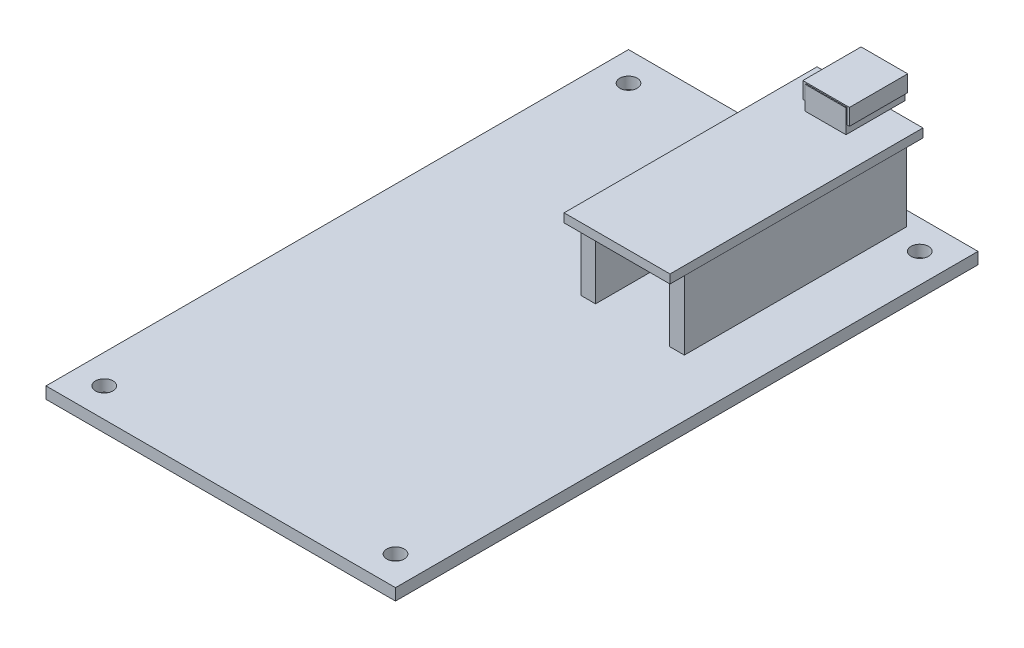
ISO-10303-21;
HEADER;
FILE_DESCRIPTION(('STEP AP214'),'2;1');
FILE_NAME('part.step','',(''),(''),'','','');
FILE_SCHEMA(('AUTOMOTIVE_DESIGN { 1 0 10303 214 1 1 1 1 }'));
ENDSEC;
DATA;
#1=APPLICATION_CONTEXT('core data for automotive mechanical design processes');
#2=APPLICATION_PROTOCOL_DEFINITION('international standard','automotive_design',2000,#1);
#3=PRODUCT_CONTEXT('',#1,'mechanical');
#4=PRODUCT('Part','Part','',(#3));
#5=PRODUCT_RELATED_PRODUCT_CATEGORY('part','',(#4));
#6=PRODUCT_DEFINITION_FORMATION('','',#4);
#7=PRODUCT_DEFINITION_CONTEXT('part definition',#1,'design');
#8=PRODUCT_DEFINITION('design','',#6,#7);
#9=PRODUCT_DEFINITION_SHAPE('','',#8);
#10=(LENGTH_UNIT() NAMED_UNIT(*) SI_UNIT(.MILLI.,.METRE.));
#11=(NAMED_UNIT(*) PLANE_ANGLE_UNIT() SI_UNIT($,.RADIAN.));
#12=(NAMED_UNIT(*) SI_UNIT($,.STERADIAN.) SOLID_ANGLE_UNIT());
#13=UNCERTAINTY_MEASURE_WITH_UNIT(LENGTH_MEASURE(1.E-05),#10,'distance_accuracy_value','');
#14=(GEOMETRIC_REPRESENTATION_CONTEXT(3) GLOBAL_UNCERTAINTY_ASSIGNED_CONTEXT((#13)) GLOBAL_UNIT_ASSIGNED_CONTEXT((#10,
#11,#12)) REPRESENTATION_CONTEXT('',''));
#15=CARTESIAN_POINT('',(0.,0.,0.));
#16=DIRECTION('',(0.,0.,1.));
#17=DIRECTION('',(1.,0.,0.));
#18=AXIS2_PLACEMENT_3D('',#15,#16,#17);
#19=CARTESIAN_POINT('',(7.831,19.5,-42.505));
#20=DIRECTION('',(1.,0.,0.));
#21=DIRECTION('',(0.,0.,-1.));
#22=AXIS2_PLACEMENT_3D('',#19,#20,#21);
#23=PLANE('',#22);
#24=DIRECTION('',(0.,1.,0.));
#25=VECTOR('',#24,1.);
#26=CARTESIAN_POINT('',(7.831,19.5,-42.665));
#27=LINE('',#26,#25);
#28=CARTESIAN_POINT('',(7.831,15.5,-42.665));
#29=VERTEX_POINT('',#28);
#30=CARTESIAN_POINT('',(7.831,19.5,-42.665));
#31=VERTEX_POINT('',#30);
#32=EDGE_CURVE('E220',#29,#31,#27,.T.);
#33=ORIENTED_EDGE('',*,*,#32,.F.);
#34=DIRECTION('',(0.,0.,1.));
#35=VECTOR('',#34,1.);
#36=CARTESIAN_POINT('',(7.831,15.5,-42.505));
#37=LINE('',#36,#35);
#38=CARTESIAN_POINT('',(7.831,15.5,-42.505));
#39=VERTEX_POINT('',#38);
#40=EDGE_CURVE('E50',#29,#39,#37,.T.);
#41=ORIENTED_EDGE('',*,*,#40,.T.);
#42=DIRECTION('',(0.,-1.,0.));
#43=VECTOR('',#42,1.);
#44=CARTESIAN_POINT('',(7.831,19.5,-42.505));
#45=LINE('',#44,#43);
#46=CARTESIAN_POINT('',(7.831,19.5,-42.505));
#47=VERTEX_POINT('',#46);
#48=EDGE_CURVE('E248',#47,#39,#45,.T.);
#49=ORIENTED_EDGE('',*,*,#48,.F.);
#50=DIRECTION('',(0.,0.,1.));
#51=VECTOR('',#50,1.);
#52=CARTESIAN_POINT('',(7.831,19.5,-42.505));
#53=LINE('',#52,#51);
#54=EDGE_CURVE('E226',#31,#47,#53,.T.);
#55=ORIENTED_EDGE('',*,*,#54,.F.);
#56=EDGE_LOOP('',(#33,#41,#49,#55));
#57=FACE_BOUND('',#56,.T.);
#58=ADVANCED_FACE('F42',(#57),#23,.F.);
#59=CARTESIAN_POINT('',(0.,19.5,0.));
#60=DIRECTION('',(0.,1.,0.));
#61=DIRECTION('',(0.,0.,1.));
#62=AXIS2_PLACEMENT_3D('',#59,#60,#61);
#63=PLANE('',#62);
#64=DIRECTION('',(0.,0.,-1.));
#65=VECTOR('',#64,1.);
#66=CARTESIAN_POINT('',(14.831,19.5,-42.505));
#67=LINE('',#66,#65);
#68=CARTESIAN_POINT('',(14.831,19.5,-42.505));
#69=VERTEX_POINT('',#68);
#70=CARTESIAN_POINT('',(14.831,19.5,-42.665));
#71=VERTEX_POINT('',#70);
#72=EDGE_CURVE('E231',#69,#71,#67,.T.);
#73=ORIENTED_EDGE('',*,*,#72,.T.);
#74=DIRECTION('',(-1.,0.,0.));
#75=VECTOR('',#74,1.);
#76=CARTESIAN_POINT('',(0.,19.5,-42.665));
#77=LINE('',#76,#75);
#78=EDGE_CURVE('E12',#71,#31,#77,.T.);
#79=ORIENTED_EDGE('',*,*,#78,.T.);
#80=ORIENTED_EDGE('',*,*,#54,.T.);
#81=DIRECTION('',(1.,0.,0.));
#82=VECTOR('',#81,1.);
#83=CARTESIAN_POINT('',(14.831,19.5,-42.505));
#84=LINE('',#83,#82);
#85=EDGE_CURVE('E228',#47,#69,#84,.T.);
#86=ORIENTED_EDGE('',*,*,#85,.T.);
#87=EDGE_LOOP('',(#73,#79,#80,#86));
#88=FACE_BOUND('',#87,.T.);
#89=ADVANCED_FACE('F325',(#88),#63,.T.);
#90=CARTESIAN_POINT('',(0.,15.5,0.));
#91=DIRECTION('',(0.,-1.,0.));
#92=DIRECTION('',(0.,0.,-1.));
#93=AXIS2_PLACEMENT_3D('',#90,#91,#92);
#94=PLANE('',#93);
#95=DIRECTION('',(-1.,0.,0.));
#96=VECTOR('',#95,1.);
#97=CARTESIAN_POINT('',(14.7648969304243,15.5,-42.665));
#98=LINE('',#97,#96);
#99=CARTESIAN_POINT('',(7.76489693042429,15.5,-42.665));
#100=VERTEX_POINT('',#99);
#101=EDGE_CURVE('E57',#29,#100,#98,.T.);
#102=ORIENTED_EDGE('',*,*,#101,.T.);
#103=DIRECTION('',(0.,0.,-1.));
#104=VECTOR('',#103,1.);
#105=CARTESIAN_POINT('',(7.76489693042429,15.5,-42.665));
#106=LINE('',#105,#104);
#107=CARTESIAN_POINT('',(7.76489693042429,15.5,-50.125));
#108=VERTEX_POINT('',#107);
#109=EDGE_CURVE('E217',#100,#108,#106,.T.);
#110=ORIENTED_EDGE('',*,*,#109,.T.);
#111=DIRECTION('',(-1.,0.,0.));
#112=VECTOR('',#111,1.);
#113=CARTESIAN_POINT('',(20.421,15.5,-50.125));
#114=LINE('',#113,#112);
#115=CARTESIAN_POINT('',(2.241,15.5,-50.125));
#116=VERTEX_POINT('',#115);
#117=EDGE_CURVE('E259',#108,#116,#114,.T.);
#118=ORIENTED_EDGE('',*,*,#117,.T.);
#119=DIRECTION('',(0.,0.,-1.));
#120=VECTOR('',#119,1.);
#121=CARTESIAN_POINT('',(2.241,15.5,-6.70499999999999));
#122=LINE('',#121,#120);
#123=CARTESIAN_POINT('',(2.241,15.5,-6.70499999999999));
#124=VERTEX_POINT('',#123);
#125=EDGE_CURVE('E255',#124,#116,#122,.T.);
#126=ORIENTED_EDGE('',*,*,#125,.F.);
#127=DIRECTION('',(-1.,0.,0.));
#128=VECTOR('',#127,1.);
#129=CARTESIAN_POINT('',(20.421,15.5,-6.70499999999999));
#130=LINE('',#129,#128);
#131=CARTESIAN_POINT('',(20.421,15.5,-6.70499999999999));
#132=VERTEX_POINT('',#131);
#133=EDGE_CURVE('E252',#132,#124,#130,.T.);
#134=ORIENTED_EDGE('',*,*,#133,.F.);
#135=DIRECTION('',(0.,0.,-1.));
#136=VECTOR('',#135,1.);
#137=CARTESIAN_POINT('',(20.421,15.5,-6.70499999999999));
#138=LINE('',#137,#136);
#139=CARTESIAN_POINT('',(20.421,15.5,-50.125));
#140=VERTEX_POINT('',#139);
#141=EDGE_CURVE('E263',#132,#140,#138,.T.);
#142=ORIENTED_EDGE('',*,*,#141,.T.);
#143=CARTESIAN_POINT('',(14.831,15.5,-50.125));
#144=VERTEX_POINT('',#143);
#145=EDGE_CURVE('E260',#140,#144,#114,.T.);
#146=ORIENTED_EDGE('',*,*,#145,.T.);
#147=DIRECTION('',(0.,0.,-1.));
#148=VECTOR('',#147,1.);
#149=CARTESIAN_POINT('',(14.831,15.5,-42.505));
#150=LINE('',#149,#148);
#151=CARTESIAN_POINT('',(14.831,15.5,-42.505));
#152=VERTEX_POINT('',#151);
#153=EDGE_CURVE('E240',#152,#144,#150,.T.);
#154=ORIENTED_EDGE('',*,*,#153,.F.);
#155=DIRECTION('',(1.,0.,0.));
#156=VECTOR('',#155,1.);
#157=CARTESIAN_POINT('',(14.831,15.5,-42.505));
#158=LINE('',#157,#156);
#159=EDGE_CURVE('E225',#39,#152,#158,.T.);
#160=ORIENTED_EDGE('',*,*,#159,.F.);
#161=ORIENTED_EDGE('',*,*,#40,.F.);
#162=EDGE_LOOP('',(#102,#110,#118,#126,#134,#142,#146,#154,#160,#161));
#163=FACE_BOUND('',#162,.T.);
#164=ADVANCED_FACE('F300',(#163),#94,.F.);
#165=CARTESIAN_POINT('',(20.421,15.5,-6.70499999999999));
#166=DIRECTION('',(0.,0.,1.));
#167=DIRECTION('',(1.,0.,0.));
#168=AXIS2_PLACEMENT_3D('',#165,#166,#167);
#169=PLANE('',#168);
#170=DIRECTION('',(-1.,0.,0.));
#171=VECTOR('',#170,1.);
#172=CARTESIAN_POINT('',(20.421,14.,-6.70499999999999));
#173=LINE('',#172,#171);
#174=CARTESIAN_POINT('',(20.421,14.,-6.70499999999999));
#175=VERTEX_POINT('',#174);
#176=CARTESIAN_POINT('',(2.241,14.,-6.70499999999999));
#177=VERTEX_POINT('',#176);
#178=EDGE_CURVE('E251',#175,#177,#173,.T.);
#179=ORIENTED_EDGE('',*,*,#178,.F.);
#180=DIRECTION('',(0.,-1.,0.));
#181=VECTOR('',#180,1.);
#182=CARTESIAN_POINT('',(20.421,15.5,-6.70499999999999));
#183=LINE('',#182,#181);
#184=EDGE_CURVE('E236',#132,#175,#183,.T.);
#185=ORIENTED_EDGE('',*,*,#184,.F.);
#186=ORIENTED_EDGE('',*,*,#133,.T.);
#187=DIRECTION('',(0.,-1.,0.));
#188=VECTOR('',#187,1.);
#189=CARTESIAN_POINT('',(2.241,15.5,-6.70499999999999));
#190=LINE('',#189,#188);
#191=EDGE_CURVE('E265',#124,#177,#190,.T.);
#192=ORIENTED_EDGE('',*,*,#191,.T.);
#193=EDGE_LOOP('',(#179,#185,#186,#192));
#194=FACE_BOUND('',#193,.T.);
#195=ADVANCED_FACE('F44',(#194),#169,.T.);
#196=CARTESIAN_POINT('',(20.421,15.5,-6.70499999999999));
#197=DIRECTION('',(-1.,0.,0.));
#198=DIRECTION('',(0.,0.,1.));
#199=AXIS2_PLACEMENT_3D('',#196,#197,#198);
#200=PLANE('',#199);
#201=DIRECTION('',(0.,0.,-1.));
#202=VECTOR('',#201,1.);
#203=CARTESIAN_POINT('',(20.421,14.,-6.70499999999999));
#204=LINE('',#203,#202);
#205=CARTESIAN_POINT('',(20.421,14.,-50.125));
#206=VERTEX_POINT('',#205);
#207=EDGE_CURVE('E256',#175,#206,#204,.T.);
#208=ORIENTED_EDGE('',*,*,#207,.T.);
#209=DIRECTION('',(0.,-1.,0.));
#210=VECTOR('',#209,1.);
#211=CARTESIAN_POINT('',(20.421,15.5,-50.125));
#212=LINE('',#211,#210);
#213=EDGE_CURVE('E276',#140,#206,#212,.T.);
#214=ORIENTED_EDGE('',*,*,#213,.F.);
#215=ORIENTED_EDGE('',*,*,#141,.F.);
#216=ORIENTED_EDGE('',*,*,#184,.T.);
#217=EDGE_LOOP('',(#208,#214,#215,#216));
#218=FACE_BOUND('',#217,.T.);
#219=ADVANCED_FACE('F294',(#218),#200,.F.);
#220=CARTESIAN_POINT('',(20.421,15.5,-50.125));
#221=DIRECTION('',(0.,0.,1.));
#222=DIRECTION('',(1.,0.,0.));
#223=AXIS2_PLACEMENT_3D('',#220,#221,#222);
#224=PLANE('',#223);
#225=DIRECTION('',(-1.,0.,0.));
#226=VECTOR('',#225,1.);
#227=CARTESIAN_POINT('',(20.421,14.,-50.125));
#228=LINE('',#227,#226);
#229=CARTESIAN_POINT('',(2.241,14.,-50.125));
#230=VERTEX_POINT('',#229);
#231=EDGE_CURVE('E271',#206,#230,#228,.T.);
#232=ORIENTED_EDGE('',*,*,#231,.T.);
#233=DIRECTION('',(0.,-1.,0.));
#234=VECTOR('',#233,1.);
#235=CARTESIAN_POINT('',(2.241,15.5,-50.125));
#236=LINE('',#235,#234);
#237=EDGE_CURVE('E279',#116,#230,#236,.T.);
#238=ORIENTED_EDGE('',*,*,#237,.F.);
#239=ORIENTED_EDGE('',*,*,#117,.F.);
#240=EDGE_CURVE('E65',#144,#108,#114,.T.);
#241=ORIENTED_EDGE('',*,*,#240,.F.);
#242=ORIENTED_EDGE('',*,*,#145,.F.);
#243=ORIENTED_EDGE('',*,*,#213,.T.);
#244=EDGE_LOOP('',(#232,#238,#239,#241,#242,#243));
#245=FACE_BOUND('',#244,.T.);
#246=ADVANCED_FACE('F298',(#245),#224,.F.);
#247=CARTESIAN_POINT('',(2.241,15.5,-6.70499999999999));
#248=DIRECTION('',(-1.,0.,0.));
#249=DIRECTION('',(0.,0.,1.));
#250=AXIS2_PLACEMENT_3D('',#247,#248,#249);
#251=PLANE('',#250);
#252=DIRECTION('',(0.,0.,-1.));
#253=VECTOR('',#252,1.);
#254=CARTESIAN_POINT('',(2.241,14.,-6.70499999999999));
#255=LINE('',#254,#253);
#256=EDGE_CURVE('E268',#177,#230,#255,.T.);
#257=ORIENTED_EDGE('',*,*,#256,.F.);
#258=ORIENTED_EDGE('',*,*,#191,.F.);
#259=ORIENTED_EDGE('',*,*,#125,.T.);
#260=ORIENTED_EDGE('',*,*,#237,.T.);
#261=EDGE_LOOP('',(#257,#258,#259,#260));
#262=FACE_BOUND('',#261,.T.);
#263=ADVANCED_FACE('F286',(#262),#251,.T.);
#264=CARTESIAN_POINT('',(0.,14.,0.));
#265=DIRECTION('',(0.,-1.,0.));
#266=DIRECTION('',(0.,0.,-1.));
#267=AXIS2_PLACEMENT_3D('',#264,#265,#266);
#268=PLANE('',#267);
#269=ORIENTED_EDGE('',*,*,#178,.T.);
#270=ORIENTED_EDGE('',*,*,#256,.T.);
#271=ORIENTED_EDGE('',*,*,#231,.F.);
#272=ORIENTED_EDGE('',*,*,#207,.F.);
#273=EDGE_LOOP('',(#269,#270,#271,#272));
#274=FACE_BOUND('',#273,.T.);
#275=ADVANCED_FACE('F291',(#274),#268,.T.);
#276=CARTESIAN_POINT('',(0.,15.5,0.));
#277=DIRECTION('',(0.,1.,0.));
#278=DIRECTION('',(0.,0.,1.));
#279=AXIS2_PLACEMENT_3D('',#276,#277,#278);
#280=PLANE('',#279);
#281=ORIENTED_EDGE('',*,*,#240,.T.);
#282=CARTESIAN_POINT('',(7.76489693042429,15.5,-52.665));
#283=VERTEX_POINT('',#282);
#284=EDGE_CURVE('E167',#108,#283,#106,.T.);
#285=ORIENTED_EDGE('',*,*,#284,.T.);
#286=DIRECTION('',(-1.,0.,0.));
#287=VECTOR('',#286,1.);
#288=CARTESIAN_POINT('',(14.831,15.5,-52.665));
#289=LINE('',#288,#287);
#290=CARTESIAN_POINT('',(14.831,15.5,-52.665));
#291=VERTEX_POINT('',#290);
#292=EDGE_CURVE('E229',#291,#283,#289,.T.);
#293=ORIENTED_EDGE('',*,*,#292,.F.);
#294=EDGE_CURVE('E239',#144,#291,#150,.T.);
#295=ORIENTED_EDGE('',*,*,#294,.F.);
#296=EDGE_LOOP('',(#281,#285,#293,#295));
#297=FACE_BOUND('',#296,.T.);
#298=ADVANCED_FACE('F304',(#297),#280,.F.);
#299=CARTESIAN_POINT('',(14.831,19.5,-42.505));
#300=DIRECTION('',(0.,0.,-1.));
#301=DIRECTION('',(-1.,0.,0.));
#302=AXIS2_PLACEMENT_3D('',#299,#300,#301);
#303=PLANE('',#302);
#304=ORIENTED_EDGE('',*,*,#159,.T.);
#305=DIRECTION('',(0.,-1.,0.));
#306=VECTOR('',#305,1.);
#307=CARTESIAN_POINT('',(14.831,19.5,-42.505));
#308=LINE('',#307,#306);
#309=EDGE_CURVE('E245',#69,#152,#308,.T.);
#310=ORIENTED_EDGE('',*,*,#309,.F.);
#311=ORIENTED_EDGE('',*,*,#85,.F.);
#312=ORIENTED_EDGE('',*,*,#48,.T.);
#313=EDGE_LOOP('',(#304,#310,#311,#312));
#314=FACE_BOUND('',#313,.T.);
#315=ADVANCED_FACE('F311',(#314),#303,.F.);
#316=CARTESIAN_POINT('',(14.831,19.5,-42.505));
#317=DIRECTION('',(-1.,0.,0.));
#318=DIRECTION('',(0.,0.,1.));
#319=AXIS2_PLACEMENT_3D('',#316,#317,#318);
#320=PLANE('',#319);
#321=DIRECTION('',(0.,-1.,0.));
#322=VECTOR('',#321,1.);
#323=CARTESIAN_POINT('',(14.831,19.5,-52.665));
#324=LINE('',#323,#322);
#325=CARTESIAN_POINT('',(14.831,16.89,-52.665));
#326=VERTEX_POINT('',#325);
#327=EDGE_CURVE('E234',#326,#291,#324,.T.);
#328=ORIENTED_EDGE('',*,*,#327,.F.);
#329=DIRECTION('',(0.,0.,1.));
#330=VECTOR('',#329,1.);
#331=CARTESIAN_POINT('',(14.831,16.89,-42.505));
#332=LINE('',#331,#330);
#333=CARTESIAN_POINT('',(14.831,16.89,-42.665));
#334=VERTEX_POINT('',#333);
#335=EDGE_CURVE('E223',#326,#334,#332,.T.);
#336=ORIENTED_EDGE('',*,*,#335,.T.);
#337=DIRECTION('',(0.,-1.,0.));
#338=VECTOR('',#337,1.);
#339=CARTESIAN_POINT('',(14.831,19.5,-42.665));
#340=LINE('',#339,#338);
#341=EDGE_CURVE('E178',#71,#334,#340,.T.);
#342=ORIENTED_EDGE('',*,*,#341,.F.);
#343=ORIENTED_EDGE('',*,*,#72,.F.);
#344=ORIENTED_EDGE('',*,*,#309,.T.);
#345=ORIENTED_EDGE('',*,*,#153,.T.);
#346=ORIENTED_EDGE('',*,*,#294,.T.);
#347=EDGE_LOOP('',(#328,#336,#342,#343,#344,#345,#346));
#348=FACE_BOUND('',#347,.T.);
#349=ADVANCED_FACE('F306',(#348),#320,.F.);
#350=CARTESIAN_POINT('',(14.831,19.5,-52.665));
#351=DIRECTION('',(0.,0.,1.));
#352=DIRECTION('',(1.,0.,0.));
#353=AXIS2_PLACEMENT_3D('',#350,#351,#352);
#354=PLANE('',#353);
#355=ORIENTED_EDGE('',*,*,#292,.T.);
#356=DIRECTION('',(0.,1.,0.));
#357=VECTOR('',#356,1.);
#358=CARTESIAN_POINT('',(7.76489693042429,15.5,-52.665));
#359=LINE('',#358,#357);
#360=CARTESIAN_POINT('',(7.76489693042429,16.89,-52.665));
#361=VERTEX_POINT('',#360);
#362=EDGE_CURVE('E202',#283,#361,#359,.T.);
#363=ORIENTED_EDGE('',*,*,#362,.T.);
#364=DIRECTION('',(-1.,0.,0.));
#365=VECTOR('',#364,1.);
#366=CARTESIAN_POINT('',(7.76489693042429,16.89,-52.665));
#367=LINE('',#366,#365);
#368=CARTESIAN_POINT('',(7.26489693042429,16.89,-52.665));
#369=VERTEX_POINT('',#368);
#370=EDGE_CURVE('E205',#361,#369,#367,.T.);
#371=ORIENTED_EDGE('',*,*,#370,.T.);
#372=DIRECTION('',(0.,1.,0.));
#373=VECTOR('',#372,1.);
#374=CARTESIAN_POINT('',(7.26489693042429,16.89,-52.665));
#375=LINE('',#374,#373);
#376=CARTESIAN_POINT('',(7.26489693042429,19.7,-52.665));
#377=VERTEX_POINT('',#376);
#378=EDGE_CURVE('E185',#369,#377,#375,.T.);
#379=ORIENTED_EDGE('',*,*,#378,.T.);
#380=DIRECTION('',(1.,0.,0.));
#381=VECTOR('',#380,1.);
#382=CARTESIAN_POINT('',(7.26489693042429,19.7,-52.665));
#383=LINE('',#382,#381);
#384=CARTESIAN_POINT('',(15.2648969304243,19.7,-52.665));
#385=VERTEX_POINT('',#384);
#386=EDGE_CURVE('E182',#377,#385,#383,.T.);
#387=ORIENTED_EDGE('',*,*,#386,.T.);
#388=DIRECTION('',(0.,-1.,0.));
#389=VECTOR('',#388,1.);
#390=CARTESIAN_POINT('',(15.2648969304243,19.7,-52.665));
#391=LINE('',#390,#389);
#392=CARTESIAN_POINT('',(15.2648969304243,16.89,-52.665));
#393=VERTEX_POINT('',#392);
#394=EDGE_CURVE('E199',#385,#393,#391,.T.);
#395=ORIENTED_EDGE('',*,*,#394,.T.);
#396=DIRECTION('',(-1.,0.,0.));
#397=VECTOR('',#396,1.);
#398=CARTESIAN_POINT('',(15.2648969304243,16.89,-52.665));
#399=LINE('',#398,#397);
#400=EDGE_CURVE('E162',#393,#326,#399,.T.);
#401=ORIENTED_EDGE('',*,*,#400,.T.);
#402=ORIENTED_EDGE('',*,*,#327,.T.);
#403=EDGE_LOOP('',(#355,#363,#371,#379,#387,#395,#401,#402));
#404=FACE_BOUND('',#403,.T.);
#405=ADVANCED_FACE('F323',(#404),#354,.F.);
#406=CARTESIAN_POINT('',(15.2648969304243,16.89,-42.665));
#407=DIRECTION('',(0.,-1.,0.));
#408=DIRECTION('',(1.,0.,0.));
#409=AXIS2_PLACEMENT_3D('',#406,#407,#408);
#410=PLANE('',#409);
#411=ORIENTED_EDGE('',*,*,#335,.F.);
#412=ORIENTED_EDGE('',*,*,#400,.F.);
#413=DIRECTION('',(0.,0.,-1.));
#414=VECTOR('',#413,1.);
#415=CARTESIAN_POINT('',(15.2648969304243,16.89,-42.665));
#416=LINE('',#415,#414);
#417=CARTESIAN_POINT('',(15.2648969304243,16.89,-42.665));
#418=VERTEX_POINT('',#417);
#419=EDGE_CURVE('E156',#418,#393,#416,.T.);
#420=ORIENTED_EDGE('',*,*,#419,.F.);
#421=DIRECTION('',(-1.,0.,0.));
#422=VECTOR('',#421,1.);
#423=CARTESIAN_POINT('',(15.2648969304243,16.89,-42.665));
#424=LINE('',#423,#422);
#425=EDGE_CURVE('E160',#418,#334,#424,.T.);
#426=ORIENTED_EDGE('',*,*,#425,.T.);
#427=EDGE_LOOP('',(#411,#412,#420,#426));
#428=FACE_BOUND('',#427,.T.);
#429=ADVANCED_FACE('F159',(#428),#410,.T.);
#430=CARTESIAN_POINT('',(0.,0.,-42.665));
#431=DIRECTION('',(0.,0.,-1.));
#432=DIRECTION('',(-1.,0.,0.));
#433=AXIS2_PLACEMENT_3D('',#430,#431,#432);
#434=PLANE('',#433);
#435=ORIENTED_EDGE('',*,*,#101,.F.);
#436=ORIENTED_EDGE('',*,*,#32,.T.);
#437=ORIENTED_EDGE('',*,*,#78,.F.);
#438=ORIENTED_EDGE('',*,*,#341,.T.);
#439=ORIENTED_EDGE('',*,*,#425,.F.);
#440=DIRECTION('',(0.,-1.,0.));
#441=VECTOR('',#440,1.);
#442=CARTESIAN_POINT('',(15.2648969304243,19.7,-42.665));
#443=LINE('',#442,#441);
#444=CARTESIAN_POINT('',(15.2648969304243,19.7,-42.665));
#445=VERTEX_POINT('',#444);
#446=EDGE_CURVE('E175',#445,#418,#443,.T.);
#447=ORIENTED_EDGE('',*,*,#446,.F.);
#448=DIRECTION('',(1.,0.,0.));
#449=VECTOR('',#448,1.);
#450=CARTESIAN_POINT('',(7.26489693042429,19.7,-42.665));
#451=LINE('',#450,#449);
#452=CARTESIAN_POINT('',(7.26489693042429,19.7,-42.665));
#453=VERTEX_POINT('',#452);
#454=EDGE_CURVE('E168',#453,#445,#451,.T.);
#455=ORIENTED_EDGE('',*,*,#454,.F.);
#456=DIRECTION('',(0.,1.,0.));
#457=VECTOR('',#456,1.);
#458=CARTESIAN_POINT('',(7.26489693042429,16.89,-42.665));
#459=LINE('',#458,#457);
#460=CARTESIAN_POINT('',(7.26489693042429,16.89,-42.665));
#461=VERTEX_POINT('',#460);
#462=EDGE_CURVE('E195',#461,#453,#459,.T.);
#463=ORIENTED_EDGE('',*,*,#462,.F.);
#464=DIRECTION('',(-1.,0.,0.));
#465=VECTOR('',#464,1.);
#466=CARTESIAN_POINT('',(7.76489693042429,16.89,-42.665));
#467=LINE('',#466,#465);
#468=CARTESIAN_POINT('',(7.76489693042429,16.89,-42.665));
#469=VERTEX_POINT('',#468);
#470=EDGE_CURVE('E192',#469,#461,#467,.T.);
#471=ORIENTED_EDGE('',*,*,#470,.F.);
#472=DIRECTION('',(0.,1.,0.));
#473=VECTOR('',#472,1.);
#474=CARTESIAN_POINT('',(7.76489693042429,15.5,-42.665));
#475=LINE('',#474,#473);
#476=EDGE_CURVE('E189',#100,#469,#475,.T.);
#477=ORIENTED_EDGE('',*,*,#476,.F.);
#478=EDGE_LOOP('',(#435,#436,#437,#438,#439,#447,#455,#463,#471,#477));
#479=FACE_BOUND('',#478,.T.);
#480=ADVANCED_FACE('F173',(#479),#434,.F.);
#481=CARTESIAN_POINT('',(15.2648969304243,19.7,-42.665));
#482=DIRECTION('',(1.,0.,0.));
#483=DIRECTION('',(0.,1.,0.));
#484=AXIS2_PLACEMENT_3D('',#481,#482,#483);
#485=PLANE('',#484);
#486=ORIENTED_EDGE('',*,*,#394,.F.);
#487=DIRECTION('',(0.,0.,-1.));
#488=VECTOR('',#487,1.);
#489=CARTESIAN_POINT('',(15.2648969304243,19.7,-42.665));
#490=LINE('',#489,#488);
#491=EDGE_CURVE('E181',#445,#385,#490,.T.);
#492=ORIENTED_EDGE('',*,*,#491,.F.);
#493=ORIENTED_EDGE('',*,*,#446,.T.);
#494=ORIENTED_EDGE('',*,*,#419,.T.);
#495=EDGE_LOOP('',(#486,#492,#493,#494));
#496=FACE_BOUND('',#495,.T.);
#497=ADVANCED_FACE('F180',(#496),#485,.T.);
#498=CARTESIAN_POINT('',(7.26489693042429,19.7,-42.665));
#499=DIRECTION('',(0.,1.,0.));
#500=DIRECTION('',(0.,0.,1.));
#501=AXIS2_PLACEMENT_3D('',#498,#499,#500);
#502=PLANE('',#501);
#503=ORIENTED_EDGE('',*,*,#386,.F.);
#504=DIRECTION('',(0.,0.,-1.));
#505=VECTOR('',#504,1.);
#506=CARTESIAN_POINT('',(7.26489693042429,19.7,-42.665));
#507=LINE('',#506,#505);
#508=EDGE_CURVE('E211',#453,#377,#507,.T.);
#509=ORIENTED_EDGE('',*,*,#508,.F.);
#510=ORIENTED_EDGE('',*,*,#454,.T.);
#511=ORIENTED_EDGE('',*,*,#491,.T.);
#512=EDGE_LOOP('',(#503,#509,#510,#511));
#513=FACE_BOUND('',#512,.T.);
#514=ADVANCED_FACE('F393',(#513),#502,.T.);
#515=CARTESIAN_POINT('',(7.26489693042429,16.89,-42.665));
#516=DIRECTION('',(-1.,0.,0.));
#517=DIRECTION('',(0.,0.,1.));
#518=AXIS2_PLACEMENT_3D('',#515,#516,#517);
#519=PLANE('',#518);
#520=ORIENTED_EDGE('',*,*,#378,.F.);
#521=DIRECTION('',(0.,0.,-1.));
#522=VECTOR('',#521,1.);
#523=CARTESIAN_POINT('',(7.26489693042429,16.89,-42.665));
#524=LINE('',#523,#522);
#525=EDGE_CURVE('E213',#461,#369,#524,.T.);
#526=ORIENTED_EDGE('',*,*,#525,.F.);
#527=ORIENTED_EDGE('',*,*,#462,.T.);
#528=ORIENTED_EDGE('',*,*,#508,.T.);
#529=EDGE_LOOP('',(#520,#526,#527,#528));
#530=FACE_BOUND('',#529,.T.);
#531=ADVANCED_FACE('F400',(#530),#519,.T.);
#532=CARTESIAN_POINT('',(7.76489693042429,16.89,-42.665));
#533=DIRECTION('',(0.,-1.,0.));
#534=DIRECTION('',(1.,0.,0.));
#535=AXIS2_PLACEMENT_3D('',#532,#533,#534);
#536=PLANE('',#535);
#537=ORIENTED_EDGE('',*,*,#370,.F.);
#538=DIRECTION('',(0.,0.,-1.));
#539=VECTOR('',#538,1.);
#540=CARTESIAN_POINT('',(7.76489693042429,16.89,-42.665));
#541=LINE('',#540,#539);
#542=EDGE_CURVE('E215',#469,#361,#541,.T.);
#543=ORIENTED_EDGE('',*,*,#542,.F.);
#544=ORIENTED_EDGE('',*,*,#470,.T.);
#545=ORIENTED_EDGE('',*,*,#525,.T.);
#546=EDGE_LOOP('',(#537,#543,#544,#545));
#547=FACE_BOUND('',#546,.T.);
#548=ADVANCED_FACE('F408',(#547),#536,.T.);
#549=CARTESIAN_POINT('',(7.76489693042429,15.5,-42.665));
#550=DIRECTION('',(-1.,0.,0.));
#551=DIRECTION('',(0.,0.,1.));
#552=AXIS2_PLACEMENT_3D('',#549,#550,#551);
#553=PLANE('',#552);
#554=ORIENTED_EDGE('',*,*,#362,.F.);
#555=ORIENTED_EDGE('',*,*,#284,.F.);
#556=ORIENTED_EDGE('',*,*,#109,.F.);
#557=ORIENTED_EDGE('',*,*,#476,.T.);
#558=ORIENTED_EDGE('',*,*,#542,.T.);
#559=EDGE_LOOP('',(#554,#555,#556,#557,#558));
#560=FACE_BOUND('',#559,.T.);
#561=ADVANCED_FACE('F319',(#560),#553,.T.);
#562=CLOSED_SHELL('',(#58,#89,#164,#195,#219,#246,#263,#275,#298,#315,#349,#405,#429,#480,#497,
#514,#531,#548,#561));
#563=MANIFOLD_SOLID_BREP('B2',#562);
#564=CARTESIAN_POINT('',(0.,2.,0.));
#565=DIRECTION('',(0.,-1.,0.));
#566=DIRECTION('',(0.,0.,-1.));
#567=AXIS2_PLACEMENT_3D('',#564,#565,#566);
#568=PLANE('',#567);
#569=DIRECTION('',(0.,0.,1.));
#570=VECTOR('',#569,1.);
#571=CARTESIAN_POINT('',(2.441,2.,-9.36499999999999));
#572=LINE('',#571,#570);
#573=CARTESIAN_POINT('',(2.441,2.,-47.465));
#574=VERTEX_POINT('',#573);
#575=CARTESIAN_POINT('',(2.441,2.,-9.36499999999999));
#576=VERTEX_POINT('',#575);
#577=EDGE_CURVE('E603',#574,#576,#572,.T.);
#578=ORIENTED_EDGE('',*,*,#577,.F.);
#579=DIRECTION('',(-1.,0.,0.));
#580=VECTOR('',#579,1.);
#581=CARTESIAN_POINT('',(4.981,2.,-47.465));
#582=LINE('',#581,#580);
#583=CARTESIAN_POINT('',(4.981,2.,-47.465));
#584=VERTEX_POINT('',#583);
#585=EDGE_CURVE('E616',#584,#574,#582,.T.);
#586=ORIENTED_EDGE('',*,*,#585,.F.);
#587=DIRECTION('',(0.,0.,-1.));
#588=VECTOR('',#587,1.);
#589=CARTESIAN_POINT('',(4.981,2.,-9.36499999999999));
#590=LINE('',#589,#588);
#591=CARTESIAN_POINT('',(4.981,2.,-9.36499999999999));
#592=VERTEX_POINT('',#591);
#593=EDGE_CURVE('E625',#592,#584,#590,.T.);
#594=ORIENTED_EDGE('',*,*,#593,.F.);
#595=DIRECTION('',(1.,0.,0.));
#596=VECTOR('',#595,1.);
#597=CARTESIAN_POINT('',(4.981,2.,-9.36499999999999));
#598=LINE('',#597,#596);
#599=EDGE_CURVE('E606',#576,#592,#598,.T.);
#600=ORIENTED_EDGE('',*,*,#599,.F.);
#601=EDGE_LOOP('',(#578,#586,#594,#600));
#602=FACE_BOUND('',#601,.T.);
#603=DIRECTION('',(0.,0.,-1.));
#604=VECTOR('',#603,1.);
#605=CARTESIAN_POINT('',(30.,2.,50.));
#606=LINE('',#605,#604);
#607=CARTESIAN_POINT('',(30.,2.,50.));
#608=VERTEX_POINT('',#607);
#609=CARTESIAN_POINT('',(30.,2.,-50.));
#610=VERTEX_POINT('',#609);
#611=EDGE_CURVE('E666',#608,#610,#606,.T.);
#612=ORIENTED_EDGE('',*,*,#611,.T.);
#613=DIRECTION('',(-1.,0.,0.));
#614=VECTOR('',#613,1.);
#615=CARTESIAN_POINT('',(-30.,2.,-50.));
#616=LINE('',#615,#614);
#617=CARTESIAN_POINT('',(-30.,2.,-50.));
#618=VERTEX_POINT('',#617);
#619=EDGE_CURVE('E669',#610,#618,#616,.T.);
#620=ORIENTED_EDGE('',*,*,#619,.T.);
#621=DIRECTION('',(0.,0.,1.));
#622=VECTOR('',#621,1.);
#623=CARTESIAN_POINT('',(-30.,2.,50.));
#624=LINE('',#623,#622);
#625=CARTESIAN_POINT('',(-30.,2.,50.));
#626=VERTEX_POINT('',#625);
#627=EDGE_CURVE('E672',#618,#626,#624,.T.);
#628=ORIENTED_EDGE('',*,*,#627,.T.);
#629=DIRECTION('',(1.,0.,0.));
#630=VECTOR('',#629,1.);
#631=CARTESIAN_POINT('',(-30.,2.,50.));
#632=LINE('',#631,#630);
#633=EDGE_CURVE('E674',#626,#608,#632,.T.);
#634=ORIENTED_EDGE('',*,*,#633,.T.);
#635=EDGE_LOOP('',(#612,#620,#628,#634));
#636=FACE_BOUND('',#635,.T.);
#637=CARTESIAN_POINT('',(-25.,2.,-45.));
#638=DIRECTION('',(0.,1.,0.));
#639=DIRECTION('',(0.,0.,1.));
#640=AXIS2_PLACEMENT_3D('',#637,#638,#639);
#641=CIRCLE('',#640,1.5);
#642=CARTESIAN_POINT('',(-25.,2.,-43.5));
#643=VERTEX_POINT('',#642);
#644=EDGE_CURVE('E660',#643,#643,#641,.T.);
#645=ORIENTED_EDGE('',*,*,#644,.F.);
#646=EDGE_LOOP('',(#645));
#647=FACE_BOUND('',#646,.T.);
#648=CARTESIAN_POINT('',(25.,2.,-45.));
#649=DIRECTION('',(0.,1.,0.));
#650=DIRECTION('',(0.,0.,-1.));
#651=AXIS2_PLACEMENT_3D('',#648,#649,#650);
#652=CIRCLE('',#651,1.5);
#653=CARTESIAN_POINT('',(25.,2.,-46.5));
#654=VERTEX_POINT('',#653);
#655=EDGE_CURVE('E654',#654,#654,#652,.T.);
#656=ORIENTED_EDGE('',*,*,#655,.F.);
#657=EDGE_LOOP('',(#656));
#658=FACE_BOUND('',#657,.T.);
#659=CARTESIAN_POINT('',(25.,2.,45.));
#660=DIRECTION('',(0.,1.,0.));
#661=DIRECTION('',(0.,0.,1.));
#662=AXIS2_PLACEMENT_3D('',#659,#660,#661);
#663=CIRCLE('',#662,1.5);
#664=CARTESIAN_POINT('',(25.,2.,46.5));
#665=VERTEX_POINT('',#664);
#666=EDGE_CURVE('E648',#665,#665,#663,.T.);
#667=ORIENTED_EDGE('',*,*,#666,.F.);
#668=EDGE_LOOP('',(#667));
#669=FACE_BOUND('',#668,.T.);
#670=CARTESIAN_POINT('',(-25.,2.,45.));
#671=DIRECTION('',(0.,1.,0.));
#672=DIRECTION('',(0.,0.,-1.));
#673=AXIS2_PLACEMENT_3D('',#670,#671,#672);
#674=CIRCLE('',#673,1.5);
#675=CARTESIAN_POINT('',(-25.,2.,43.5));
#676=VERTEX_POINT('',#675);
#677=EDGE_CURVE('E642',#676,#676,#674,.T.);
#678=ORIENTED_EDGE('',*,*,#677,.F.);
#679=EDGE_LOOP('',(#678));
#680=FACE_BOUND('',#679,.T.);
#681=DIRECTION('',(0.,0.,1.));
#682=VECTOR('',#681,1.);
#683=CARTESIAN_POINT('',(17.681,2.,-9.365));
#684=LINE('',#683,#682);
#685=CARTESIAN_POINT('',(17.681,2.,-47.465));
#686=VERTEX_POINT('',#685);
#687=CARTESIAN_POINT('',(17.681,2.,-9.365));
#688=VERTEX_POINT('',#687);
#689=EDGE_CURVE('E602',#686,#688,#684,.T.);
#690=ORIENTED_EDGE('',*,*,#689,.F.);
#691=DIRECTION('',(-1.,0.,0.));
#692=VECTOR('',#691,1.);
#693=CARTESIAN_POINT('',(20.221,2.,-47.465));
#694=LINE('',#693,#692);
#695=CARTESIAN_POINT('',(20.221,2.,-47.465));
#696=VERTEX_POINT('',#695);
#697=EDGE_CURVE('E599',#696,#686,#694,.T.);
#698=ORIENTED_EDGE('',*,*,#697,.F.);
#699=DIRECTION('',(0.,0.,-1.));
#700=VECTOR('',#699,1.);
#701=CARTESIAN_POINT('',(20.221,2.,-9.365));
#702=LINE('',#701,#700);
#703=CARTESIAN_POINT('',(20.221,2.,-9.365));
#704=VERTEX_POINT('',#703);
#705=EDGE_CURVE('E513',#704,#696,#702,.T.);
#706=ORIENTED_EDGE('',*,*,#705,.F.);
#707=DIRECTION('',(1.,0.,0.));
#708=VECTOR('',#707,1.);
#709=CARTESIAN_POINT('',(20.221,2.,-9.365));
#710=LINE('',#709,#708);
#711=EDGE_CURVE('E508',#688,#704,#710,.T.);
#712=ORIENTED_EDGE('',*,*,#711,.F.);
#713=EDGE_LOOP('',(#690,#698,#706,#712));
#714=FACE_BOUND('',#713,.T.);
#715=ADVANCED_FACE('F493',(#602,#636,#647,#658,#669,#680,#714),#568,.F.);
#716=CARTESIAN_POINT('',(0.,0.,0.));
#717=DIRECTION('',(0.,-1.,0.));
#718=DIRECTION('',(0.,0.,-1.));
#719=AXIS2_PLACEMENT_3D('',#716,#717,#718);
#720=PLANE('',#719);
#721=CARTESIAN_POINT('',(25.,0.,45.));
#722=DIRECTION('',(0.,1.,0.));
#723=DIRECTION('',(0.,0.,1.));
#724=AXIS2_PLACEMENT_3D('',#721,#722,#723);
#725=CIRCLE('',#724,1.5);
#726=CARTESIAN_POINT('',(25.,0.,46.5));
#727=VERTEX_POINT('',#726);
#728=EDGE_CURVE('E645',#727,#727,#725,.T.);
#729=ORIENTED_EDGE('',*,*,#728,.T.);
#730=EDGE_LOOP('',(#729));
#731=FACE_BOUND('',#730,.T.);
#732=CARTESIAN_POINT('',(-25.,0.,-45.));
#733=DIRECTION('',(0.,1.,0.));
#734=DIRECTION('',(0.,0.,1.));
#735=AXIS2_PLACEMENT_3D('',#732,#733,#734);
#736=CIRCLE('',#735,1.5);
#737=CARTESIAN_POINT('',(-25.,0.,-43.5));
#738=VERTEX_POINT('',#737);
#739=EDGE_CURVE('E657',#738,#738,#736,.T.);
#740=ORIENTED_EDGE('',*,*,#739,.T.);
#741=EDGE_LOOP('',(#740));
#742=FACE_BOUND('',#741,.T.);
#743=DIRECTION('',(0.,0.,-1.));
#744=VECTOR('',#743,1.);
#745=CARTESIAN_POINT('',(30.,0.,50.));
#746=LINE('',#745,#744);
#747=CARTESIAN_POINT('',(30.,0.,50.));
#748=VERTEX_POINT('',#747);
#749=CARTESIAN_POINT('',(30.,0.,-50.));
#750=VERTEX_POINT('',#749);
#751=EDGE_CURVE('E663',#748,#750,#746,.T.);
#752=ORIENTED_EDGE('',*,*,#751,.F.);
#753=DIRECTION('',(1.,0.,0.));
#754=VECTOR('',#753,1.);
#755=CARTESIAN_POINT('',(-30.,0.,50.));
#756=LINE('',#755,#754);
#757=CARTESIAN_POINT('',(-30.,0.,50.));
#758=VERTEX_POINT('',#757);
#759=EDGE_CURVE('E670',#758,#748,#756,.T.);
#760=ORIENTED_EDGE('',*,*,#759,.F.);
#761=DIRECTION('',(0.,0.,1.));
#762=VECTOR('',#761,1.);
#763=CARTESIAN_POINT('',(-30.,0.,50.));
#764=LINE('',#763,#762);
#765=CARTESIAN_POINT('',(-30.,0.,-50.));
#766=VERTEX_POINT('',#765);
#767=EDGE_CURVE('E681',#766,#758,#764,.T.);
#768=ORIENTED_EDGE('',*,*,#767,.F.);
#769=DIRECTION('',(-1.,0.,0.));
#770=VECTOR('',#769,1.);
#771=CARTESIAN_POINT('',(-30.,0.,-50.));
#772=LINE('',#771,#770);
#773=EDGE_CURVE('E679',#750,#766,#772,.T.);
#774=ORIENTED_EDGE('',*,*,#773,.F.);
#775=EDGE_LOOP('',(#752,#760,#768,#774));
#776=FACE_BOUND('',#775,.T.);
#777=CARTESIAN_POINT('',(25.,0.,-45.));
#778=DIRECTION('',(0.,1.,0.));
#779=DIRECTION('',(0.,0.,-1.));
#780=AXIS2_PLACEMENT_3D('',#777,#778,#779);
#781=CIRCLE('',#780,1.5);
#782=CARTESIAN_POINT('',(25.,0.,-46.5));
#783=VERTEX_POINT('',#782);
#784=EDGE_CURVE('E651',#783,#783,#781,.T.);
#785=ORIENTED_EDGE('',*,*,#784,.T.);
#786=EDGE_LOOP('',(#785));
#787=FACE_BOUND('',#786,.T.);
#788=CARTESIAN_POINT('',(-25.,0.,45.));
#789=DIRECTION('',(0.,1.,0.));
#790=DIRECTION('',(0.,0.,-1.));
#791=AXIS2_PLACEMENT_3D('',#788,#789,#790);
#792=CIRCLE('',#791,1.5);
#793=CARTESIAN_POINT('',(-25.,0.,43.5));
#794=VERTEX_POINT('',#793);
#795=EDGE_CURVE('E641',#794,#794,#792,.T.);
#796=ORIENTED_EDGE('',*,*,#795,.T.);
#797=EDGE_LOOP('',(#796));
#798=FACE_BOUND('',#797,.T.);
#799=ADVANCED_FACE('F699',(#731,#742,#776,#787,#798),#720,.T.);
#800=CARTESIAN_POINT('',(30.,2.,50.));
#801=DIRECTION('',(-1.,0.,0.));
#802=DIRECTION('',(0.,0.,1.));
#803=AXIS2_PLACEMENT_3D('',#800,#801,#802);
#804=PLANE('',#803);
#805=ORIENTED_EDGE('',*,*,#751,.T.);
#806=DIRECTION('',(0.,-1.,0.));
#807=VECTOR('',#806,1.);
#808=CARTESIAN_POINT('',(30.,2.,-50.));
#809=LINE('',#808,#807);
#810=EDGE_CURVE('E40',#610,#750,#809,.T.);
#811=ORIENTED_EDGE('',*,*,#810,.F.);
#812=ORIENTED_EDGE('',*,*,#611,.F.);
#813=DIRECTION('',(0.,-1.,0.));
#814=VECTOR('',#813,1.);
#815=CARTESIAN_POINT('',(30.,2.,50.));
#816=LINE('',#815,#814);
#817=EDGE_CURVE('E676',#608,#748,#816,.T.);
#818=ORIENTED_EDGE('',*,*,#817,.T.);
#819=EDGE_LOOP('',(#805,#811,#812,#818));
#820=FACE_BOUND('',#819,.T.);
#821=ADVANCED_FACE('F495',(#820),#804,.F.);
#822=CARTESIAN_POINT('',(-30.,2.,-50.));
#823=DIRECTION('',(0.,0.,1.));
#824=DIRECTION('',(1.,0.,0.));
#825=AXIS2_PLACEMENT_3D('',#822,#823,#824);
#826=PLANE('',#825);
#827=ORIENTED_EDGE('',*,*,#773,.T.);
#828=DIRECTION('',(0.,-1.,0.));
#829=VECTOR('',#828,1.);
#830=CARTESIAN_POINT('',(-30.,2.,-50.));
#831=LINE('',#830,#829);
#832=EDGE_CURVE('E501',#618,#766,#831,.T.);
#833=ORIENTED_EDGE('',*,*,#832,.F.);
#834=ORIENTED_EDGE('',*,*,#619,.F.);
#835=ORIENTED_EDGE('',*,*,#810,.T.);
#836=EDGE_LOOP('',(#827,#833,#834,#835));
#837=FACE_BOUND('',#836,.T.);
#838=ADVANCED_FACE('F710',(#837),#826,.F.);
#839=CARTESIAN_POINT('',(-30.,2.,50.));
#840=DIRECTION('',(1.,0.,0.));
#841=DIRECTION('',(0.,0.,-1.));
#842=AXIS2_PLACEMENT_3D('',#839,#840,#841);
#843=PLANE('',#842);
#844=ORIENTED_EDGE('',*,*,#767,.T.);
#845=DIRECTION('',(0.,-1.,0.));
#846=VECTOR('',#845,1.);
#847=CARTESIAN_POINT('',(-30.,2.,50.));
#848=LINE('',#847,#846);
#849=EDGE_CURVE('E686',#626,#758,#848,.T.);
#850=ORIENTED_EDGE('',*,*,#849,.F.);
#851=ORIENTED_EDGE('',*,*,#627,.F.);
#852=ORIENTED_EDGE('',*,*,#832,.T.);
#853=EDGE_LOOP('',(#844,#850,#851,#852));
#854=FACE_BOUND('',#853,.T.);
#855=ADVANCED_FACE('F693',(#854),#843,.F.);
#856=CARTESIAN_POINT('',(-30.,2.,50.));
#857=DIRECTION('',(0.,0.,-1.));
#858=DIRECTION('',(-1.,0.,0.));
#859=AXIS2_PLACEMENT_3D('',#856,#857,#858);
#860=PLANE('',#859);
#861=ORIENTED_EDGE('',*,*,#759,.T.);
#862=ORIENTED_EDGE('',*,*,#817,.F.);
#863=ORIENTED_EDGE('',*,*,#633,.F.);
#864=ORIENTED_EDGE('',*,*,#849,.T.);
#865=EDGE_LOOP('',(#861,#862,#863,#864));
#866=FACE_BOUND('',#865,.T.);
#867=ADVANCED_FACE('F703',(#866),#860,.F.);
#868=CARTESIAN_POINT('',(-25.,2.,-45.));
#869=DIRECTION('',(0.,-1.,0.));
#870=DIRECTION('',(0.,0.,-1.));
#871=AXIS2_PLACEMENT_3D('',#868,#869,#870);
#872=CYLINDRICAL_SURFACE('',#871,1.5);
#873=ORIENTED_EDGE('',*,*,#644,.T.);
#874=EDGE_LOOP('',(#873));
#875=FACE_BOUND('',#874,.T.);
#876=ORIENTED_EDGE('',*,*,#739,.F.);
#877=EDGE_LOOP('',(#876));
#878=FACE_BOUND('',#877,.T.);
#879=ADVANCED_FACE('F726',(#875,#878),#872,.F.);
#880=CARTESIAN_POINT('',(25.,2.,-45.));
#881=DIRECTION('',(0.,-1.,0.));
#882=DIRECTION('',(0.,0.,-1.));
#883=AXIS2_PLACEMENT_3D('',#880,#881,#882);
#884=CYLINDRICAL_SURFACE('',#883,1.5);
#885=ORIENTED_EDGE('',*,*,#655,.T.);
#886=EDGE_LOOP('',(#885));
#887=FACE_BOUND('',#886,.T.);
#888=ORIENTED_EDGE('',*,*,#784,.F.);
#889=EDGE_LOOP('',(#888));
#890=FACE_BOUND('',#889,.T.);
#891=ADVANCED_FACE('F733',(#887,#890),#884,.F.);
#892=CARTESIAN_POINT('',(25.,2.,45.));
#893=DIRECTION('',(0.,-1.,0.));
#894=DIRECTION('',(0.,0.,-1.));
#895=AXIS2_PLACEMENT_3D('',#892,#893,#894);
#896=CYLINDRICAL_SURFACE('',#895,1.5);
#897=ORIENTED_EDGE('',*,*,#666,.T.);
#898=EDGE_LOOP('',(#897));
#899=FACE_BOUND('',#898,.T.);
#900=ORIENTED_EDGE('',*,*,#728,.F.);
#901=EDGE_LOOP('',(#900));
#902=FACE_BOUND('',#901,.T.);
#903=ADVANCED_FACE('F738',(#899,#902),#896,.F.);
#904=CARTESIAN_POINT('',(-25.,2.,45.));
#905=DIRECTION('',(0.,-1.,0.));
#906=DIRECTION('',(0.,0.,-1.));
#907=AXIS2_PLACEMENT_3D('',#904,#905,#906);
#908=CYLINDRICAL_SURFACE('',#907,1.5);
#909=ORIENTED_EDGE('',*,*,#677,.T.);
#910=EDGE_LOOP('',(#909));
#911=FACE_BOUND('',#910,.T.);
#912=ORIENTED_EDGE('',*,*,#795,.F.);
#913=EDGE_LOOP('',(#912));
#914=FACE_BOUND('',#913,.T.);
#915=ADVANCED_FACE('F796',(#911,#914),#908,.F.);
#916=CARTESIAN_POINT('',(2.441,14.,-9.36499999999999));
#917=DIRECTION('',(1.,0.,0.));
#918=DIRECTION('',(0.,0.,-1.));
#919=AXIS2_PLACEMENT_3D('',#916,#917,#918);
#920=PLANE('',#919);
#921=ORIENTED_EDGE('',*,*,#577,.T.);
#922=DIRECTION('',(0.,-1.,0.));
#923=VECTOR('',#922,1.);
#924=CARTESIAN_POINT('',(2.441,14.,-9.36499999999999));
#925=LINE('',#924,#923);
#926=CARTESIAN_POINT('',(2.441,14.,-9.36499999999999));
#927=VERTEX_POINT('',#926);
#928=EDGE_CURVE('E638',#927,#576,#925,.T.);
#929=ORIENTED_EDGE('',*,*,#928,.F.);
#930=DIRECTION('',(0.,0.,1.));
#931=VECTOR('',#930,1.);
#932=CARTESIAN_POINT('',(2.441,14.,-9.36499999999999));
#933=LINE('',#932,#931);
#934=CARTESIAN_POINT('',(2.441,14.,-47.465));
#935=VERTEX_POINT('',#934);
#936=EDGE_CURVE('E612',#935,#927,#933,.T.);
#937=ORIENTED_EDGE('',*,*,#936,.F.);
#938=DIRECTION('',(0.,-1.,0.));
#939=VECTOR('',#938,1.);
#940=CARTESIAN_POINT('',(2.441,14.,-47.465));
#941=LINE('',#940,#939);
#942=EDGE_CURVE('E621',#935,#574,#941,.T.);
#943=ORIENTED_EDGE('',*,*,#942,.T.);
#944=EDGE_LOOP('',(#921,#929,#937,#943));
#945=FACE_BOUND('',#944,.T.);
#946=ADVANCED_FACE('F792',(#945),#920,.F.);
#947=CARTESIAN_POINT('',(4.981,14.,-9.36499999999999));
#948=DIRECTION('',(0.,0.,-1.));
#949=DIRECTION('',(-1.,0.,0.));
#950=AXIS2_PLACEMENT_3D('',#947,#948,#949);
#951=PLANE('',#950);
#952=ORIENTED_EDGE('',*,*,#599,.T.);
#953=DIRECTION('',(0.,-1.,0.));
#954=VECTOR('',#953,1.);
#955=CARTESIAN_POINT('',(4.981,14.,-9.36499999999999));
#956=LINE('',#955,#954);
#957=CARTESIAN_POINT('',(4.981,14.,-9.36499999999999));
#958=VERTEX_POINT('',#957);
#959=EDGE_CURVE('E635',#958,#592,#956,.T.);
#960=ORIENTED_EDGE('',*,*,#959,.F.);
#961=DIRECTION('',(1.,0.,0.));
#962=VECTOR('',#961,1.);
#963=CARTESIAN_POINT('',(4.981,14.,-9.36499999999999));
#964=LINE('',#963,#962);
#965=EDGE_CURVE('E615',#927,#958,#964,.T.);
#966=ORIENTED_EDGE('',*,*,#965,.F.);
#967=ORIENTED_EDGE('',*,*,#928,.T.);
#968=EDGE_LOOP('',(#952,#960,#966,#967));
#969=FACE_BOUND('',#968,.T.);
#970=ADVANCED_FACE('F788',(#969),#951,.F.);
#971=CARTESIAN_POINT('',(4.981,14.,-9.36499999999999));
#972=DIRECTION('',(-1.,0.,0.));
#973=DIRECTION('',(0.,0.,1.));
#974=AXIS2_PLACEMENT_3D('',#971,#972,#973);
#975=PLANE('',#974);
#976=ORIENTED_EDGE('',*,*,#593,.T.);
#977=DIRECTION('',(0.,-1.,0.));
#978=VECTOR('',#977,1.);
#979=CARTESIAN_POINT('',(4.981,14.,-47.465));
#980=LINE('',#979,#978);
#981=CARTESIAN_POINT('',(4.981,14.,-47.465));
#982=VERTEX_POINT('',#981);
#983=EDGE_CURVE('E632',#982,#584,#980,.T.);
#984=ORIENTED_EDGE('',*,*,#983,.F.);
#985=DIRECTION('',(0.,0.,-1.));
#986=VECTOR('',#985,1.);
#987=CARTESIAN_POINT('',(4.981,14.,-9.36499999999999));
#988=LINE('',#987,#986);
#989=EDGE_CURVE('E618',#958,#982,#988,.T.);
#990=ORIENTED_EDGE('',*,*,#989,.F.);
#991=ORIENTED_EDGE('',*,*,#959,.T.);
#992=EDGE_LOOP('',(#976,#984,#990,#991));
#993=FACE_BOUND('',#992,.T.);
#994=ADVANCED_FACE('F784',(#993),#975,.F.);
#995=CARTESIAN_POINT('',(4.981,14.,-47.465));
#996=DIRECTION('',(0.,0.,1.));
#997=DIRECTION('',(1.,0.,0.));
#998=AXIS2_PLACEMENT_3D('',#995,#996,#997);
#999=PLANE('',#998);
#1000=ORIENTED_EDGE('',*,*,#585,.T.);
#1001=ORIENTED_EDGE('',*,*,#942,.F.);
#1002=DIRECTION('',(-1.,0.,0.));
#1003=VECTOR('',#1002,1.);
#1004=CARTESIAN_POINT('',(4.981,14.,-47.465));
#1005=LINE('',#1004,#1003);
#1006=EDGE_CURVE('E620',#982,#935,#1005,.T.);
#1007=ORIENTED_EDGE('',*,*,#1006,.F.);
#1008=ORIENTED_EDGE('',*,*,#983,.T.);
#1009=EDGE_LOOP('',(#1000,#1001,#1007,#1008));
#1010=FACE_BOUND('',#1009,.T.);
#1011=ADVANCED_FACE('F780',(#1010),#999,.F.);
#1012=CARTESIAN_POINT('',(0.,14.,0.));
#1013=DIRECTION('',(0.,1.,0.));
#1014=DIRECTION('',(0.,0.,1.));
#1015=AXIS2_PLACEMENT_3D('',#1012,#1013,#1014);
#1016=PLANE('',#1015);
#1017=ORIENTED_EDGE('',*,*,#936,.T.);
#1018=ORIENTED_EDGE('',*,*,#965,.T.);
#1019=ORIENTED_EDGE('',*,*,#989,.T.);
#1020=ORIENTED_EDGE('',*,*,#1006,.T.);
#1021=EDGE_LOOP('',(#1017,#1018,#1019,#1020));
#1022=FACE_BOUND('',#1021,.T.);
#1023=ADVANCED_FACE('F777',(#1022),#1016,.T.);
#1024=CARTESIAN_POINT('',(17.681,14.,-9.365));
#1025=DIRECTION('',(1.,0.,0.));
#1026=DIRECTION('',(0.,0.,-1.));
#1027=AXIS2_PLACEMENT_3D('',#1024,#1025,#1026);
#1028=PLANE('',#1027);
#1029=ORIENTED_EDGE('',*,*,#689,.T.);
#1030=DIRECTION('',(0.,-1.,0.));
#1031=VECTOR('',#1030,1.);
#1032=CARTESIAN_POINT('',(17.681,14.,-9.365));
#1033=LINE('',#1032,#1031);
#1034=CARTESIAN_POINT('',(17.681,14.,-9.365));
#1035=VERTEX_POINT('',#1034);
#1036=EDGE_CURVE('E583',#1035,#688,#1033,.T.);
#1037=ORIENTED_EDGE('',*,*,#1036,.F.);
#1038=DIRECTION('',(0.,0.,1.));
#1039=VECTOR('',#1038,1.);
#1040=CARTESIAN_POINT('',(17.681,14.,-9.365));
#1041=LINE('',#1040,#1039);
#1042=CARTESIAN_POINT('',(17.681,14.,-47.465));
#1043=VERTEX_POINT('',#1042);
#1044=EDGE_CURVE('E590',#1043,#1035,#1041,.T.);
#1045=ORIENTED_EDGE('',*,*,#1044,.F.);
#1046=DIRECTION('',(0.,-1.,0.));
#1047=VECTOR('',#1046,1.);
#1048=CARTESIAN_POINT('',(17.681,14.,-47.465));
#1049=LINE('',#1048,#1047);
#1050=EDGE_CURVE('E755',#1043,#686,#1049,.T.);
#1051=ORIENTED_EDGE('',*,*,#1050,.T.);
#1052=EDGE_LOOP('',(#1029,#1037,#1045,#1051));
#1053=FACE_BOUND('',#1052,.T.);
#1054=ADVANCED_FACE('F601',(#1053),#1028,.F.);
#1055=CARTESIAN_POINT('',(20.221,14.,-9.365));
#1056=DIRECTION('',(0.,0.,-1.));
#1057=DIRECTION('',(-1.,0.,0.));
#1058=AXIS2_PLACEMENT_3D('',#1055,#1056,#1057);
#1059=PLANE('',#1058);
#1060=ORIENTED_EDGE('',*,*,#711,.T.);
#1061=DIRECTION('',(0.,-1.,0.));
#1062=VECTOR('',#1061,1.);
#1063=CARTESIAN_POINT('',(20.221,14.,-9.365));
#1064=LINE('',#1063,#1062);
#1065=CARTESIAN_POINT('',(20.221,14.,-9.365));
#1066=VERTEX_POINT('',#1065);
#1067=EDGE_CURVE('E586',#1066,#704,#1064,.T.);
#1068=ORIENTED_EDGE('',*,*,#1067,.F.);
#1069=DIRECTION('',(1.,0.,0.));
#1070=VECTOR('',#1069,1.);
#1071=CARTESIAN_POINT('',(20.221,14.,-9.365));
#1072=LINE('',#1071,#1070);
#1073=EDGE_CURVE('E579',#1035,#1066,#1072,.T.);
#1074=ORIENTED_EDGE('',*,*,#1073,.F.);
#1075=ORIENTED_EDGE('',*,*,#1036,.T.);
#1076=EDGE_LOOP('',(#1060,#1068,#1074,#1075));
#1077=FACE_BOUND('',#1076,.T.);
#1078=ADVANCED_FACE('F581',(#1077),#1059,.F.);
#1079=CARTESIAN_POINT('',(20.221,14.,-9.365));
#1080=DIRECTION('',(-1.,0.,0.));
#1081=DIRECTION('',(0.,0.,1.));
#1082=AXIS2_PLACEMENT_3D('',#1079,#1080,#1081);
#1083=PLANE('',#1082);
#1084=ORIENTED_EDGE('',*,*,#705,.T.);
#1085=DIRECTION('',(0.,-1.,0.));
#1086=VECTOR('',#1085,1.);
#1087=CARTESIAN_POINT('',(20.221,14.,-47.465));
#1088=LINE('',#1087,#1086);
#1089=CARTESIAN_POINT('',(20.221,14.,-47.465));
#1090=VERTEX_POINT('',#1089);
#1091=EDGE_CURVE('E608',#1090,#696,#1088,.T.);
#1092=ORIENTED_EDGE('',*,*,#1091,.F.);
#1093=DIRECTION('',(0.,0.,-1.));
#1094=VECTOR('',#1093,1.);
#1095=CARTESIAN_POINT('',(20.221,14.,-9.365));
#1096=LINE('',#1095,#1094);
#1097=EDGE_CURVE('E589',#1066,#1090,#1096,.T.);
#1098=ORIENTED_EDGE('',*,*,#1097,.F.);
#1099=ORIENTED_EDGE('',*,*,#1067,.T.);
#1100=EDGE_LOOP('',(#1084,#1092,#1098,#1099));
#1101=FACE_BOUND('',#1100,.T.);
#1102=ADVANCED_FACE('F764',(#1101),#1083,.F.);
#1103=CARTESIAN_POINT('',(20.221,14.,-47.465));
#1104=DIRECTION('',(0.,0.,1.));
#1105=DIRECTION('',(1.,0.,0.));
#1106=AXIS2_PLACEMENT_3D('',#1103,#1104,#1105);
#1107=PLANE('',#1106);
#1108=ORIENTED_EDGE('',*,*,#697,.T.);
#1109=ORIENTED_EDGE('',*,*,#1050,.F.);
#1110=DIRECTION('',(-1.,0.,0.));
#1111=VECTOR('',#1110,1.);
#1112=CARTESIAN_POINT('',(20.221,14.,-47.465));
#1113=LINE('',#1112,#1111);
#1114=EDGE_CURVE('E595',#1090,#1043,#1113,.T.);
#1115=ORIENTED_EDGE('',*,*,#1114,.F.);
#1116=ORIENTED_EDGE('',*,*,#1091,.T.);
#1117=EDGE_LOOP('',(#1108,#1109,#1115,#1116));
#1118=FACE_BOUND('',#1117,.T.);
#1119=ADVANCED_FACE('F754',(#1118),#1107,.F.);
#1120=CARTESIAN_POINT('',(0.,14.,0.));
#1121=DIRECTION('',(0.,1.,0.));
#1122=DIRECTION('',(0.,0.,1.));
#1123=AXIS2_PLACEMENT_3D('',#1120,#1121,#1122);
#1124=PLANE('',#1123);
#1125=ORIENTED_EDGE('',*,*,#1044,.T.);
#1126=ORIENTED_EDGE('',*,*,#1073,.T.);
#1127=ORIENTED_EDGE('',*,*,#1097,.T.);
#1128=ORIENTED_EDGE('',*,*,#1114,.T.);
#1129=EDGE_LOOP('',(#1125,#1126,#1127,#1128));
#1130=FACE_BOUND('',#1129,.T.);
#1131=ADVANCED_FACE('F593',(#1130),#1124,.T.);
#1132=CLOSED_SHELL('',(#715,#799,#821,#838,#855,#867,#879,#891,#903,#915,#946,#970,#994,#1011,
#1023,#1054,#1078,#1102,#1119,#1131));
#1133=MANIFOLD_SOLID_BREP('B6',#1132);
#1134=ADVANCED_BREP_SHAPE_REPRESENTATION('',(#18,#563,#1133),#14);
#1135=SHAPE_DEFINITION_REPRESENTATION(#9,#1134);
ENDSEC;
END-ISO-10303-21;
